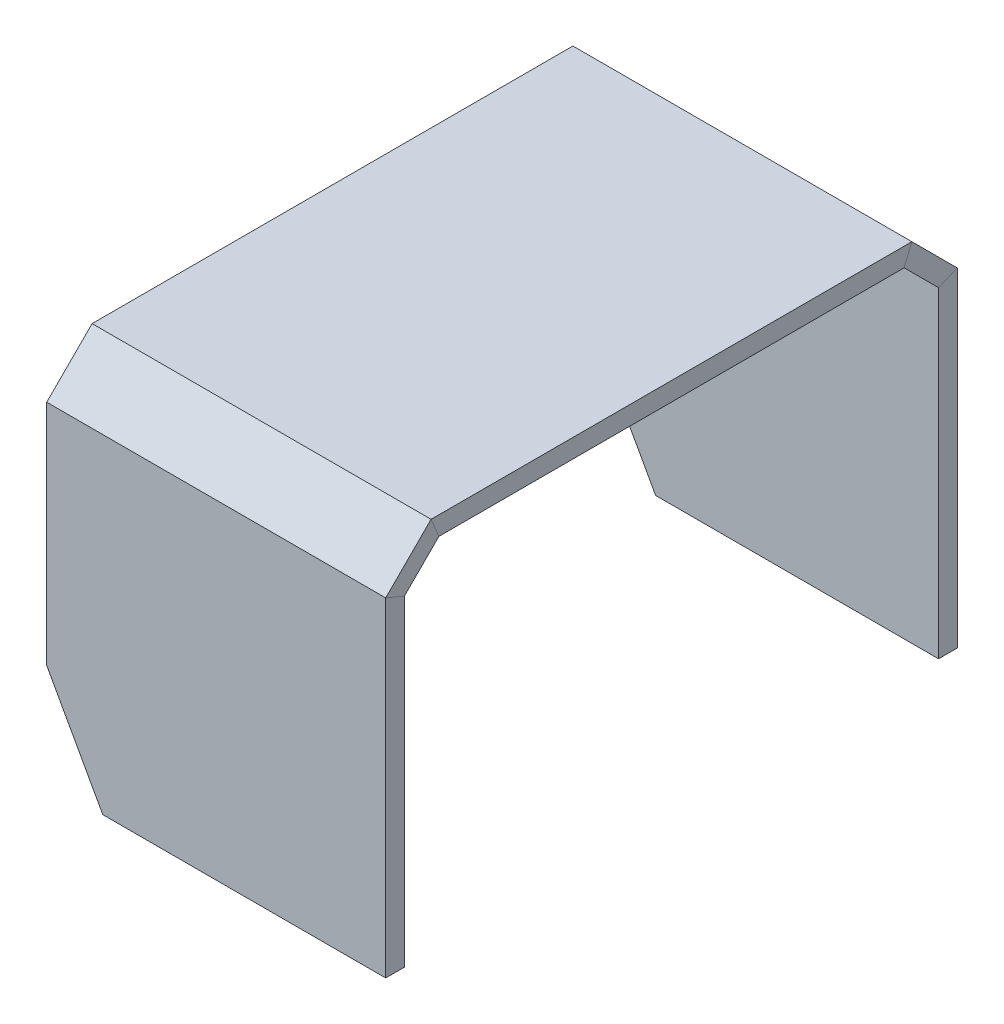
ISO-10303-21;
HEADER;
FILE_DESCRIPTION(('STEP AP214'),'2;1');
FILE_NAME('part.step','',(''),(''),'','','');
FILE_SCHEMA(('AUTOMOTIVE_DESIGN { 1 0 10303 214 1 1 1 1 }'));
ENDSEC;
DATA;
#1=APPLICATION_CONTEXT('core data for automotive mechanical design processes');
#2=APPLICATION_PROTOCOL_DEFINITION('international standard','automotive_design',2000,#1);
#3=PRODUCT_CONTEXT('',#1,'mechanical');
#4=PRODUCT('Part','Part','',(#3));
#5=PRODUCT_RELATED_PRODUCT_CATEGORY('part','',(#4));
#6=PRODUCT_DEFINITION_FORMATION('','',#4);
#7=PRODUCT_DEFINITION_CONTEXT('part definition',#1,'design');
#8=PRODUCT_DEFINITION('design','',#6,#7);
#9=PRODUCT_DEFINITION_SHAPE('','',#8);
#10=(LENGTH_UNIT() NAMED_UNIT(*) SI_UNIT(.MILLI.,.METRE.));
#11=(NAMED_UNIT(*) PLANE_ANGLE_UNIT() SI_UNIT($,.RADIAN.));
#12=(NAMED_UNIT(*) SI_UNIT($,.STERADIAN.) SOLID_ANGLE_UNIT());
#13=UNCERTAINTY_MEASURE_WITH_UNIT(LENGTH_MEASURE(1.E-05),#10,'distance_accuracy_value','');
#14=(GEOMETRIC_REPRESENTATION_CONTEXT(3) GLOBAL_UNCERTAINTY_ASSIGNED_CONTEXT((#13)) GLOBAL_UNIT_ASSIGNED_CONTEXT((#10,
#11,#12)) REPRESENTATION_CONTEXT('',''));
#15=CARTESIAN_POINT('',(0.,0.,0.));
#16=DIRECTION('',(0.,0.,1.));
#17=DIRECTION('',(1.,0.,0.));
#18=AXIS2_PLACEMENT_3D('',#15,#16,#17);
#19=CARTESIAN_POINT('',(0.,0.,0.));
#20=DIRECTION('',(0.,1.,0.));
#21=DIRECTION('',(0.,0.,1.));
#22=AXIS2_PLACEMENT_3D('',#19,#20,#21);
#23=PLANE('',#22);
#24=DIRECTION('',(1.,0.,0.));
#25=VECTOR('',#24,1.);
#26=CARTESIAN_POINT('',(-50.,0.,76.3));
#27=LINE('',#26,#25);
#28=CARTESIAN_POINT('',(-52.0299999999999,0.,76.3));
#29=VERTEX_POINT('',#28);
#30=CARTESIAN_POINT('',(23.5,0.,76.3));
#31=VERTEX_POINT('',#30);
#32=EDGE_CURVE('E148',#29,#31,#27,.T.);
#33=ORIENTED_EDGE('',*,*,#32,.F.);
#34=DIRECTION('',(0.,0.,-1.));
#35=VECTOR('',#34,1.);
#36=CARTESIAN_POINT('',(-52.0299999999999,0.,76.3));
#37=LINE('',#36,#35);
#38=CARTESIAN_POINT('',(-52.0299999999999,0.,71.3));
#39=VERTEX_POINT('',#38);
#40=EDGE_CURVE('E134',#29,#39,#37,.T.);
#41=ORIENTED_EDGE('',*,*,#40,.T.);
#42=DIRECTION('',(-1.,0.,0.));
#43=VECTOR('',#42,1.);
#44=CARTESIAN_POINT('',(-50.,0.,71.3));
#45=LINE('',#44,#43);
#46=CARTESIAN_POINT('',(23.5,0.,71.3));
#47=VERTEX_POINT('',#46);
#48=EDGE_CURVE('E162',#47,#39,#45,.T.);
#49=ORIENTED_EDGE('',*,*,#48,.F.);
#50=DIRECTION('',(0.,0.,-1.));
#51=VECTOR('',#50,1.);
#52=CARTESIAN_POINT('',(23.5,0.,71.3));
#53=LINE('',#52,#51);
#54=EDGE_CURVE('E155',#31,#47,#53,.T.);
#55=ORIENTED_EDGE('',*,*,#54,.F.);
#56=EDGE_LOOP('',(#33,#41,#49,#55));
#57=FACE_BOUND('',#56,.T.);
#58=ADVANCED_FACE('F37',(#57),#23,.F.);
#59=CARTESIAN_POINT('',(0.,0.,0.));
#60=DIRECTION('',(0.,-1.,0.));
#61=DIRECTION('',(0.,0.,-1.));
#62=AXIS2_PLACEMENT_3D('',#59,#60,#61);
#63=PLANE('',#62);
#64=CARTESIAN_POINT('',(-52.0299999999999,0.,-71.3));
#65=VERTEX_POINT('',#64);
#66=CARTESIAN_POINT('',(-52.0299999999999,0.,-76.3));
#67=VERTEX_POINT('',#66);
#68=EDGE_CURVE('E142',#65,#67,#37,.T.);
#69=ORIENTED_EDGE('',*,*,#68,.T.);
#70=DIRECTION('',(1.,0.,0.));
#71=VECTOR('',#70,1.);
#72=CARTESIAN_POINT('',(-50.,0.,-76.3));
#73=LINE('',#72,#71);
#74=CARTESIAN_POINT('',(23.5,0.,-76.3));
#75=VERTEX_POINT('',#74);
#76=EDGE_CURVE('E201',#67,#75,#73,.T.);
#77=ORIENTED_EDGE('',*,*,#76,.T.);
#78=DIRECTION('',(0.,0.,1.));
#79=VECTOR('',#78,1.);
#80=CARTESIAN_POINT('',(23.5,0.,-71.3));
#81=LINE('',#80,#79);
#82=CARTESIAN_POINT('',(23.5,0.,-71.3));
#83=VERTEX_POINT('',#82);
#84=EDGE_CURVE('E203',#75,#83,#81,.T.);
#85=ORIENTED_EDGE('',*,*,#84,.T.);
#86=DIRECTION('',(-1.,0.,0.));
#87=VECTOR('',#86,1.);
#88=CARTESIAN_POINT('',(-50.,0.,-71.3));
#89=LINE('',#88,#87);
#90=EDGE_CURVE('E208',#83,#65,#89,.T.);
#91=ORIENTED_EDGE('',*,*,#90,.T.);
#92=EDGE_LOOP('',(#69,#77,#85,#91));
#93=FACE_BOUND('',#92,.T.);
#94=ADVANCED_FACE('F305',(#93),#63,.T.);
#95=CARTESIAN_POINT('',(-50.,88.089087296526,76.3));
#96=DIRECTION('',(0.,0.,-1.));
#97=DIRECTION('',(-1.,0.,0.));
#98=AXIS2_PLACEMENT_3D('',#95,#96,#97);
#99=PLANE('',#98);
#100=DIRECTION('',(0.,1.,0.));
#101=VECTOR('',#100,1.);
#102=CARTESIAN_POINT('',(-67.0000000000001,0.,76.3));
#103=LINE('',#102,#101);
#104=CARTESIAN_POINT('',(-67.0000000000001,27.,76.3));
#105=VERTEX_POINT('',#104);
#106=CARTESIAN_POINT('',(-67.0000000000001,87.8855339059328,76.3));
#107=VERTEX_POINT('',#106);
#108=EDGE_CURVE('E151',#105,#107,#103,.T.);
#109=ORIENTED_EDGE('',*,*,#108,.F.);
#110=DIRECTION('',(0.484900196960247,-0.874569493515475,0.));
#111=VECTOR('',#110,1.);
#112=CARTESIAN_POINT('',(-52.0299999999999,0.,76.3));
#113=LINE('',#112,#111);
#114=EDGE_CURVE('E51',#105,#29,#113,.T.);
#115=ORIENTED_EDGE('',*,*,#114,.T.);
#116=ORIENTED_EDGE('',*,*,#32,.T.);
#117=DIRECTION('',(0.,-1.,0.));
#118=VECTOR('',#117,1.);
#119=CARTESIAN_POINT('',(23.5,88.089087296526,76.3));
#120=LINE('',#119,#118);
#121=CARTESIAN_POINT('',(23.5,87.8855339059328,76.3));
#122=VERTEX_POINT('',#121);
#123=EDGE_CURVE('E160',#122,#31,#120,.T.);
#124=ORIENTED_EDGE('',*,*,#123,.F.);
#125=DIRECTION('',(-1.,0.,0.));
#126=VECTOR('',#125,1.);
#127=CARTESIAN_POINT('',(-50.,87.8855339059328,76.3));
#128=LINE('',#127,#126);
#129=EDGE_CURVE('E239',#122,#107,#128,.T.);
#130=ORIENTED_EDGE('',*,*,#129,.T.);
#131=EDGE_LOOP('',(#109,#115,#116,#124,#130));
#132=FACE_BOUND('',#131,.T.);
#133=ADVANCED_FACE('F146',(#132),#99,.F.);
#134=CARTESIAN_POINT('',(23.5,88.089087296526,71.3));
#135=DIRECTION('',(-1.,0.,0.));
#136=DIRECTION('',(0.,0.,1.));
#137=AXIS2_PLACEMENT_3D('',#134,#135,#136);
#138=PLANE('',#137);
#139=DIRECTION('',(0.,0.38268343236509,0.923879532511287));
#140=VECTOR('',#139,1.);
#141=CARTESIAN_POINT('',(23.5,83.5789691705449,65.903033008589));
#142=LINE('',#141,#140);
#143=CARTESIAN_POINT('',(23.5,85.8144660940673,71.3));
#144=VERTEX_POINT('',#143);
#145=EDGE_CURVE('E242',#144,#122,#142,.T.);
#146=ORIENTED_EDGE('',*,*,#145,.T.);
#147=ORIENTED_EDGE('',*,*,#123,.T.);
#148=ORIENTED_EDGE('',*,*,#54,.T.);
#149=DIRECTION('',(0.,-1.,0.));
#150=VECTOR('',#149,1.);
#151=CARTESIAN_POINT('',(23.5,88.089087296526,71.3));
#152=LINE('',#151,#150);
#153=EDGE_CURVE('E157',#144,#47,#152,.T.);
#154=ORIENTED_EDGE('',*,*,#153,.F.);
#155=EDGE_LOOP('',(#146,#147,#148,#154));
#156=FACE_BOUND('',#155,.T.);
#157=ADVANCED_FACE('F297',(#156),#138,.F.);
#158=CARTESIAN_POINT('',(-50.,88.089087296526,71.3));
#159=DIRECTION('',(0.,0.,1.));
#160=DIRECTION('',(1.,0.,0.));
#161=AXIS2_PLACEMENT_3D('',#158,#159,#160);
#162=PLANE('',#161);
#163=ORIENTED_EDGE('',*,*,#48,.T.);
#164=DIRECTION('',(-0.484900196960247,0.874569493515475,0.));
#165=VECTOR('',#164,1.);
#166=CARTESIAN_POINT('',(-88.9094147265864,66.5159784647853,71.3));
#167=LINE('',#166,#165);
#168=CARTESIAN_POINT('',(-66.9999999999999,27.,71.3));
#169=VERTEX_POINT('',#168);
#170=EDGE_CURVE('E137',#39,#169,#167,.T.);
#171=ORIENTED_EDGE('',*,*,#170,.T.);
#172=DIRECTION('',(0.,-1.,0.));
#173=VECTOR('',#172,1.);
#174=CARTESIAN_POINT('',(-67.0000000000001,85.8144660940673,71.3));
#175=LINE('',#174,#173);
#176=CARTESIAN_POINT('',(-67.0000000000001,85.8144660940673,71.3));
#177=VERTEX_POINT('',#176);
#178=EDGE_CURVE('E248',#177,#169,#175,.T.);
#179=ORIENTED_EDGE('',*,*,#178,.F.);
#180=DIRECTION('',(1.,0.,0.));
#181=VECTOR('',#180,1.);
#182=CARTESIAN_POINT('',(-50.,85.8144660940673,71.3));
#183=LINE('',#182,#181);
#184=EDGE_CURVE('E175',#177,#144,#183,.T.);
#185=ORIENTED_EDGE('',*,*,#184,.T.);
#186=ORIENTED_EDGE('',*,*,#153,.T.);
#187=EDGE_LOOP('',(#163,#171,#179,#185,#186));
#188=FACE_BOUND('',#187,.T.);
#189=ADVANCED_FACE('F246',(#188),#162,.F.);
#190=CARTESIAN_POINT('',(-50.,96.6084000768893,60.506066017178));
#191=DIRECTION('',(0.,0.707106781186547,0.707106781186547));
#192=DIRECTION('',(0.,-0.707106781186548,0.707106781186548));
#193=AXIS2_PLACEMENT_3D('',#190,#191,#192);
#194=PLANE('',#193);
#195=ORIENTED_EDGE('',*,*,#184,.F.);
#196=DIRECTION('',(0.,-0.707106781186548,0.707106781186547));
#197=VECTOR('',#196,1.);
#198=CARTESIAN_POINT('',(-67.0000000000001,95.,62.1144660940673));
#199=LINE('',#198,#197);
#200=CARTESIAN_POINT('',(-67.0000000000001,95.,62.1144660940673));
#201=VERTEX_POINT('',#200);
#202=EDGE_CURVE('E252',#201,#177,#199,.T.);
#203=ORIENTED_EDGE('',*,*,#202,.F.);
#204=DIRECTION('',(1.,0.,0.));
#205=VECTOR('',#204,1.);
#206=CARTESIAN_POINT('',(-50.,95.,62.1144660940673));
#207=LINE('',#206,#205);
#208=CARTESIAN_POINT('',(23.5,95.,62.1144660940673));
#209=VERTEX_POINT('',#208);
#210=EDGE_CURVE('E233',#201,#209,#207,.T.);
#211=ORIENTED_EDGE('',*,*,#210,.T.);
#212=DIRECTION('',(0.,-0.707106781186547,0.707106781186547));
#213=VECTOR('',#212,1.);
#214=CARTESIAN_POINT('',(23.5,96.6084000768893,60.506066017178));
#215=LINE('',#214,#213);
#216=EDGE_CURVE('E165',#209,#144,#215,.T.);
#217=ORIENTED_EDGE('',*,*,#216,.T.);
#218=EDGE_LOOP('',(#195,#203,#211,#217));
#219=FACE_BOUND('',#218,.T.);
#220=ADVANCED_FACE('F251',(#219),#194,.F.);
#221=CARTESIAN_POINT('',(23.5,96.6084000768893,60.506066017178));
#222=DIRECTION('',(-1.,0.,0.));
#223=DIRECTION('',(0.,0.,1.));
#224=AXIS2_PLACEMENT_3D('',#221,#222,#223);
#225=PLANE('',#224);
#226=ORIENTED_EDGE('',*,*,#216,.F.);
#227=DIRECTION('',(0.,0.923879532511287,0.38268343236509));
#228=VECTOR('',#227,1.);
#229=CARTESIAN_POINT('',(23.5,50.2742397766585,43.5884496221121));
#230=LINE('',#229,#228);
#231=CARTESIAN_POINT('',(23.5,100.,64.1855339059328));
#232=VERTEX_POINT('',#231);
#233=EDGE_CURVE('E230',#209,#232,#230,.T.);
#234=ORIENTED_EDGE('',*,*,#233,.T.);
#235=DIRECTION('',(0.,-0.707106781186547,0.707106781186547));
#236=VECTOR('',#235,1.);
#237=CARTESIAN_POINT('',(23.5,100.143933982822,64.0415999231107));
#238=LINE('',#237,#236);
#239=EDGE_CURVE('E169',#232,#122,#238,.T.);
#240=ORIENTED_EDGE('',*,*,#239,.T.);
#241=ORIENTED_EDGE('',*,*,#145,.F.);
#242=EDGE_LOOP('',(#226,#234,#240,#241));
#243=FACE_BOUND('',#242,.T.);
#244=ADVANCED_FACE('F296',(#243),#225,.F.);
#245=CARTESIAN_POINT('',(-50.,100.143933982822,64.0415999231107));
#246=DIRECTION('',(0.,-0.707106781186547,-0.707106781186547));
#247=DIRECTION('',(0.,0.707106781186548,-0.707106781186548));
#248=AXIS2_PLACEMENT_3D('',#245,#246,#247);
#249=PLANE('',#248);
#250=ORIENTED_EDGE('',*,*,#239,.F.);
#251=DIRECTION('',(-1.,0.,0.));
#252=VECTOR('',#251,1.);
#253=CARTESIAN_POINT('',(-50.,100.,64.1855339059328));
#254=LINE('',#253,#252);
#255=CARTESIAN_POINT('',(-67.0000000000001,100.,64.1855339059328));
#256=VERTEX_POINT('',#255);
#257=EDGE_CURVE('E226',#232,#256,#254,.T.);
#258=ORIENTED_EDGE('',*,*,#257,.T.);
#259=DIRECTION('',(0.,0.707106781186548,-0.707106781186547));
#260=VECTOR('',#259,1.);
#261=CARTESIAN_POINT('',(-67.0000000000001,87.8855339059328,76.3));
#262=LINE('',#261,#260);
#263=EDGE_CURVE('E189',#107,#256,#262,.T.);
#264=ORIENTED_EDGE('',*,*,#263,.F.);
#265=ORIENTED_EDGE('',*,*,#129,.F.);
#266=EDGE_LOOP('',(#250,#258,#264,#265));
#267=FACE_BOUND('',#266,.T.);
#268=ADVANCED_FACE('F339',(#267),#249,.F.);
#269=CARTESIAN_POINT('',(-50.,95.,-64.389087296526));
#270=DIRECTION('',(0.,1.,0.));
#271=DIRECTION('',(0.,0.,1.));
#272=AXIS2_PLACEMENT_3D('',#269,#270,#271);
#273=PLANE('',#272);
#274=ORIENTED_EDGE('',*,*,#210,.F.);
#275=DIRECTION('',(0.,0.,1.));
#276=VECTOR('',#275,1.);
#277=CARTESIAN_POINT('',(-67.0000000000001,95.,-62.1144660940672));
#278=LINE('',#277,#276);
#279=CARTESIAN_POINT('',(-67.0000000000001,95.,-62.1144660940672));
#280=VERTEX_POINT('',#279);
#281=EDGE_CURVE('E257',#280,#201,#278,.T.);
#282=ORIENTED_EDGE('',*,*,#281,.F.);
#283=DIRECTION('',(1.,0.,0.));
#284=VECTOR('',#283,1.);
#285=CARTESIAN_POINT('',(-50.,95.,-62.1144660940672));
#286=LINE('',#285,#284);
#287=CARTESIAN_POINT('',(23.5,95.,-62.1144660940672));
#288=VERTEX_POINT('',#287);
#289=EDGE_CURVE('E219',#280,#288,#286,.T.);
#290=ORIENTED_EDGE('',*,*,#289,.T.);
#291=DIRECTION('',(0.,0.,1.));
#292=VECTOR('',#291,1.);
#293=CARTESIAN_POINT('',(23.5,95.,-64.389087296526));
#294=LINE('',#293,#292);
#295=EDGE_CURVE('E236',#288,#209,#294,.T.);
#296=ORIENTED_EDGE('',*,*,#295,.T.);
#297=EDGE_LOOP('',(#274,#282,#290,#296));
#298=FACE_BOUND('',#297,.T.);
#299=ADVANCED_FACE('F291',(#298),#273,.F.);
#300=CARTESIAN_POINT('',(23.5,95.,-64.389087296526));
#301=DIRECTION('',(-1.,0.,0.));
#302=DIRECTION('',(0.,-1.,0.));
#303=AXIS2_PLACEMENT_3D('',#300,#301,#302);
#304=PLANE('',#303);
#305=ORIENTED_EDGE('',*,*,#295,.F.);
#306=DIRECTION('',(0.,0.923879532511287,-0.382683432365089));
#307=VECTOR('',#306,1.);
#308=CARTESIAN_POINT('',(23.5,89.603033008589,-59.8789691705449));
#309=LINE('',#308,#307);
#310=CARTESIAN_POINT('',(23.5,100.,-64.1855339059327));
#311=VERTEX_POINT('',#310);
#312=EDGE_CURVE('E216',#288,#311,#309,.T.);
#313=ORIENTED_EDGE('',*,*,#312,.T.);
#314=DIRECTION('',(0.,0.,1.));
#315=VECTOR('',#314,1.);
#316=CARTESIAN_POINT('',(23.5,100.,-64.389087296526));
#317=LINE('',#316,#315);
#318=EDGE_CURVE('E235',#311,#232,#317,.T.);
#319=ORIENTED_EDGE('',*,*,#318,.T.);
#320=ORIENTED_EDGE('',*,*,#233,.F.);
#321=EDGE_LOOP('',(#305,#313,#319,#320));
#322=FACE_BOUND('',#321,.T.);
#323=ADVANCED_FACE('F294',(#322),#304,.F.);
#324=CARTESIAN_POINT('',(-50.,100.,-64.389087296526));
#325=DIRECTION('',(0.,-1.,0.));
#326=DIRECTION('',(0.,0.,-1.));
#327=AXIS2_PLACEMENT_3D('',#324,#325,#326);
#328=PLANE('',#327);
#329=ORIENTED_EDGE('',*,*,#318,.F.);
#330=DIRECTION('',(-1.,0.,0.));
#331=VECTOR('',#330,1.);
#332=CARTESIAN_POINT('',(-50.,100.,-64.1855339059327));
#333=LINE('',#332,#331);
#334=CARTESIAN_POINT('',(-67.0000000000001,100.,-64.1855339059327));
#335=VERTEX_POINT('',#334);
#336=EDGE_CURVE('E204',#311,#335,#333,.T.);
#337=ORIENTED_EDGE('',*,*,#336,.T.);
#338=DIRECTION('',(0.,0.,-1.));
#339=VECTOR('',#338,1.);
#340=CARTESIAN_POINT('',(-67.0000000000001,100.,64.1855339059328));
#341=LINE('',#340,#339);
#342=EDGE_CURVE('E182',#256,#335,#341,.T.);
#343=ORIENTED_EDGE('',*,*,#342,.F.);
#344=ORIENTED_EDGE('',*,*,#257,.F.);
#345=EDGE_LOOP('',(#329,#337,#343,#344));
#346=FACE_BOUND('',#345,.T.);
#347=ADVANCED_FACE('F270',(#346),#328,.F.);
#348=CARTESIAN_POINT('',(-50.,84.206066017178,-72.9084000768893));
#349=DIRECTION('',(0.,0.707106781186548,-0.707106781186547));
#350=DIRECTION('',(0.,0.707106781186547,0.707106781186548));
#351=AXIS2_PLACEMENT_3D('',#348,#349,#350);
#352=PLANE('',#351);
#353=ORIENTED_EDGE('',*,*,#289,.F.);
#354=DIRECTION('',(0.,0.707106781186547,0.707106781186548));
#355=VECTOR('',#354,1.);
#356=CARTESIAN_POINT('',(-67.0000000000001,85.8144660940673,-71.3));
#357=LINE('',#356,#355);
#358=CARTESIAN_POINT('',(-67.0000000000001,85.8144660940673,-71.3));
#359=VERTEX_POINT('',#358);
#360=EDGE_CURVE('E260',#359,#280,#357,.T.);
#361=ORIENTED_EDGE('',*,*,#360,.F.);
#362=DIRECTION('',(1.,0.,0.));
#363=VECTOR('',#362,1.);
#364=CARTESIAN_POINT('',(-50.,85.8144660940673,-71.3));
#365=LINE('',#364,#363);
#366=CARTESIAN_POINT('',(23.5,85.8144660940673,-71.3));
#367=VERTEX_POINT('',#366);
#368=EDGE_CURVE('E197',#359,#367,#365,.T.);
#369=ORIENTED_EDGE('',*,*,#368,.T.);
#370=DIRECTION('',(0.,0.707106781186547,0.707106781186548));
#371=VECTOR('',#370,1.);
#372=CARTESIAN_POINT('',(23.5,84.206066017178,-72.9084000768893));
#373=LINE('',#372,#371);
#374=EDGE_CURVE('E223',#367,#288,#373,.T.);
#375=ORIENTED_EDGE('',*,*,#374,.T.);
#376=EDGE_LOOP('',(#353,#361,#369,#375));
#377=FACE_BOUND('',#376,.T.);
#378=ADVANCED_FACE('F329',(#377),#352,.F.);
#379=CARTESIAN_POINT('',(23.5,84.206066017178,-72.9084000768893));
#380=DIRECTION('',(-1.,0.,0.));
#381=DIRECTION('',(0.,-1.,0.));
#382=AXIS2_PLACEMENT_3D('',#379,#380,#381);
#383=PLANE('',#382);
#384=ORIENTED_EDGE('',*,*,#374,.F.);
#385=DIRECTION('',(0.,0.38268343236509,-0.923879532511287));
#386=VECTOR('',#385,1.);
#387=CARTESIAN_POINT('',(23.5,73.2472284965426,-40.9600045504909));
#388=LINE('',#387,#386);
#389=CARTESIAN_POINT('',(23.5,87.8855339059327,-76.3));
#390=VERTEX_POINT('',#389);
#391=EDGE_CURVE('E194',#367,#390,#388,.T.);
#392=ORIENTED_EDGE('',*,*,#391,.T.);
#393=DIRECTION('',(0.,0.707106781186547,0.707106781186548));
#394=VECTOR('',#393,1.);
#395=CARTESIAN_POINT('',(23.5,87.7415999231107,-76.443933982822));
#396=LINE('',#395,#394);
#397=EDGE_CURVE('E222',#390,#311,#396,.T.);
#398=ORIENTED_EDGE('',*,*,#397,.T.);
#399=ORIENTED_EDGE('',*,*,#312,.F.);
#400=EDGE_LOOP('',(#384,#392,#398,#399));
#401=FACE_BOUND('',#400,.T.);
#402=ADVANCED_FACE('F326',(#401),#383,.F.);
#403=CARTESIAN_POINT('',(-50.,87.7415999231107,-76.443933982822));
#404=DIRECTION('',(0.,-0.707106781186548,0.707106781186547));
#405=DIRECTION('',(0.,-0.707106781186547,-0.707106781186548));
#406=AXIS2_PLACEMENT_3D('',#403,#404,#405);
#407=PLANE('',#406);
#408=ORIENTED_EDGE('',*,*,#397,.F.);
#409=DIRECTION('',(-1.,0.,0.));
#410=VECTOR('',#409,1.);
#411=CARTESIAN_POINT('',(-50.,87.8855339059328,-76.3));
#412=LINE('',#411,#410);
#413=CARTESIAN_POINT('',(-67.0000000000001,87.8855339059328,-76.3));
#414=VERTEX_POINT('',#413);
#415=EDGE_CURVE('E44',#390,#414,#412,.T.);
#416=ORIENTED_EDGE('',*,*,#415,.T.);
#417=DIRECTION('',(0.,-0.707106781186547,-0.707106781186548));
#418=VECTOR('',#417,1.);
#419=CARTESIAN_POINT('',(-67.0000000000001,100.,-64.1855339059327));
#420=LINE('',#419,#418);
#421=EDGE_CURVE('E179',#335,#414,#420,.T.);
#422=ORIENTED_EDGE('',*,*,#421,.F.);
#423=ORIENTED_EDGE('',*,*,#336,.F.);
#424=EDGE_LOOP('',(#408,#416,#422,#423));
#425=FACE_BOUND('',#424,.T.);
#426=ADVANCED_FACE('F274',(#425),#407,.F.);
#427=CARTESIAN_POINT('',(-50.,0.,-71.3));
#428=DIRECTION('',(0.,0.,-1.));
#429=DIRECTION('',(-1.,0.,0.));
#430=AXIS2_PLACEMENT_3D('',#427,#428,#429);
#431=PLANE('',#430);
#432=DIRECTION('',(0.,1.,0.));
#433=VECTOR('',#432,1.);
#434=CARTESIAN_POINT('',(-67.0000000000001,0.,-71.3));
#435=LINE('',#434,#433);
#436=CARTESIAN_POINT('',(-67.0000000000001,27.0000000000005,-71.3));
#437=VERTEX_POINT('',#436);
#438=EDGE_CURVE('E281',#437,#359,#435,.T.);
#439=ORIENTED_EDGE('',*,*,#438,.F.);
#440=DIRECTION('',(0.484900196960247,-0.874569493515475,0.));
#441=VECTOR('',#440,1.);
#442=CARTESIAN_POINT('',(-51.5526897519454,-0.860880206911937,-71.3));
#443=LINE('',#442,#441);
#444=EDGE_CURVE('E58',#437,#65,#443,.T.);
#445=ORIENTED_EDGE('',*,*,#444,.T.);
#446=ORIENTED_EDGE('',*,*,#90,.F.);
#447=DIRECTION('',(0.,1.,0.));
#448=VECTOR('',#447,1.);
#449=CARTESIAN_POINT('',(23.5,0.,-71.3));
#450=LINE('',#449,#448);
#451=EDGE_CURVE('E200',#83,#367,#450,.T.);
#452=ORIENTED_EDGE('',*,*,#451,.T.);
#453=ORIENTED_EDGE('',*,*,#368,.F.);
#454=EDGE_LOOP('',(#439,#445,#446,#452,#453));
#455=FACE_BOUND('',#454,.T.);
#456=ADVANCED_FACE('F316',(#455),#431,.F.);
#457=CARTESIAN_POINT('',(23.5,0.,-71.3));
#458=DIRECTION('',(-1.,0.,0.));
#459=DIRECTION('',(0.,0.,1.));
#460=AXIS2_PLACEMENT_3D('',#457,#458,#459);
#461=PLANE('',#460);
#462=ORIENTED_EDGE('',*,*,#451,.F.);
#463=ORIENTED_EDGE('',*,*,#84,.F.);
#464=DIRECTION('',(0.,1.,0.));
#465=VECTOR('',#464,1.);
#466=CARTESIAN_POINT('',(23.5,0.,-76.3));
#467=LINE('',#466,#465);
#468=EDGE_CURVE('E205',#75,#390,#467,.T.);
#469=ORIENTED_EDGE('',*,*,#468,.T.);
#470=ORIENTED_EDGE('',*,*,#391,.F.);
#471=EDGE_LOOP('',(#462,#463,#469,#470));
#472=FACE_BOUND('',#471,.T.);
#473=ADVANCED_FACE('F308',(#472),#461,.F.);
#474=CARTESIAN_POINT('',(-50.,0.,-76.3));
#475=DIRECTION('',(0.,0.,1.));
#476=DIRECTION('',(1.,0.,0.));
#477=AXIS2_PLACEMENT_3D('',#474,#475,#476);
#478=PLANE('',#477);
#479=ORIENTED_EDGE('',*,*,#76,.F.);
#480=DIRECTION('',(0.484900196960247,-0.874569493515475,0.));
#481=VECTOR('',#480,1.);
#482=CARTESIAN_POINT('',(-52.0299999999999,0.,-76.3));
#483=LINE('',#482,#481);
#484=CARTESIAN_POINT('',(-66.9999999999999,27.,-76.3));
#485=VERTEX_POINT('',#484);
#486=EDGE_CURVE('E153',#485,#67,#483,.T.);
#487=ORIENTED_EDGE('',*,*,#486,.F.);
#488=DIRECTION('',(0.,-1.,0.));
#489=VECTOR('',#488,1.);
#490=CARTESIAN_POINT('',(-67.0000000000001,87.8855339059328,-76.3));
#491=LINE('',#490,#489);
#492=EDGE_CURVE('E280',#414,#485,#491,.T.);
#493=ORIENTED_EDGE('',*,*,#492,.F.);
#494=ORIENTED_EDGE('',*,*,#415,.F.);
#495=ORIENTED_EDGE('',*,*,#468,.F.);
#496=EDGE_LOOP('',(#479,#487,#493,#494,#495));
#497=FACE_BOUND('',#496,.T.);
#498=ADVANCED_FACE('F278',(#497),#478,.F.);
#499=CARTESIAN_POINT('',(-67.0000000000001,0.,0.));
#500=DIRECTION('',(-1.,0.,0.));
#501=DIRECTION('',(0.,0.,1.));
#502=AXIS2_PLACEMENT_3D('',#499,#500,#501);
#503=PLANE('',#502);
#504=DIRECTION('',(0.,0.,-1.));
#505=VECTOR('',#504,1.);
#506=CARTESIAN_POINT('',(-66.9999999999999,27.,76.3));
#507=LINE('',#506,#505);
#508=EDGE_CURVE('E152',#105,#169,#507,.T.);
#509=ORIENTED_EDGE('',*,*,#508,.F.);
#510=ORIENTED_EDGE('',*,*,#108,.T.);
#511=ORIENTED_EDGE('',*,*,#263,.T.);
#512=ORIENTED_EDGE('',*,*,#342,.T.);
#513=ORIENTED_EDGE('',*,*,#421,.T.);
#514=ORIENTED_EDGE('',*,*,#492,.T.);
#515=DIRECTION('',(0.,0.,-1.));
#516=VECTOR('',#515,1.);
#517=CARTESIAN_POINT('',(-67.0000000000001,27.0000000000005,0.));
#518=LINE('',#517,#516);
#519=EDGE_CURVE('E11',#437,#485,#518,.T.);
#520=ORIENTED_EDGE('',*,*,#519,.F.);
#521=ORIENTED_EDGE('',*,*,#438,.T.);
#522=ORIENTED_EDGE('',*,*,#360,.T.);
#523=ORIENTED_EDGE('',*,*,#281,.T.);
#524=ORIENTED_EDGE('',*,*,#202,.T.);
#525=ORIENTED_EDGE('',*,*,#178,.T.);
#526=EDGE_LOOP('',(#509,#510,#511,#512,#513,#514,#520,#521,#522,#523,#524,#525));
#527=FACE_BOUND('',#526,.T.);
#528=ADVANCED_FACE('F254',(#527),#503,.T.);
#529=CARTESIAN_POINT('',(-52.0299999999999,0.,76.3));
#530=DIRECTION('',(0.874569493515475,0.484900196960247,0.));
#531=DIRECTION('',(-0.484900196960247,0.874569493515475,0.));
#532=AXIS2_PLACEMENT_3D('',#529,#530,#531);
#533=PLANE('',#532);
#534=ORIENTED_EDGE('',*,*,#519,.T.);
#535=ORIENTED_EDGE('',*,*,#486,.T.);
#536=ORIENTED_EDGE('',*,*,#68,.F.);
#537=ORIENTED_EDGE('',*,*,#444,.F.);
#538=EDGE_LOOP('',(#534,#535,#536,#537));
#539=FACE_BOUND('',#538,.T.);
#540=ADVANCED_FACE('F314',(#539),#533,.F.);
#541=ORIENTED_EDGE('',*,*,#40,.F.);
#542=ORIENTED_EDGE('',*,*,#114,.F.);
#543=ORIENTED_EDGE('',*,*,#508,.T.);
#544=ORIENTED_EDGE('',*,*,#170,.F.);
#545=EDGE_LOOP('',(#541,#542,#543,#544));
#546=FACE_BOUND('',#545,.T.);
#547=ADVANCED_FACE('F135',(#546),#533,.F.);
#548=CLOSED_SHELL('',(#58,#94,#133,#157,#189,#220,#244,#268,#299,#323,#347,#378,#402,#426,#456,
#473,#498,#528,#540,#547));
#549=MANIFOLD_SOLID_BREP('B2',#548);
#550=ADVANCED_BREP_SHAPE_REPRESENTATION('',(#18,#549),#14);
#551=SHAPE_DEFINITION_REPRESENTATION(#9,#550);
ENDSEC;
END-ISO-10303-21;
